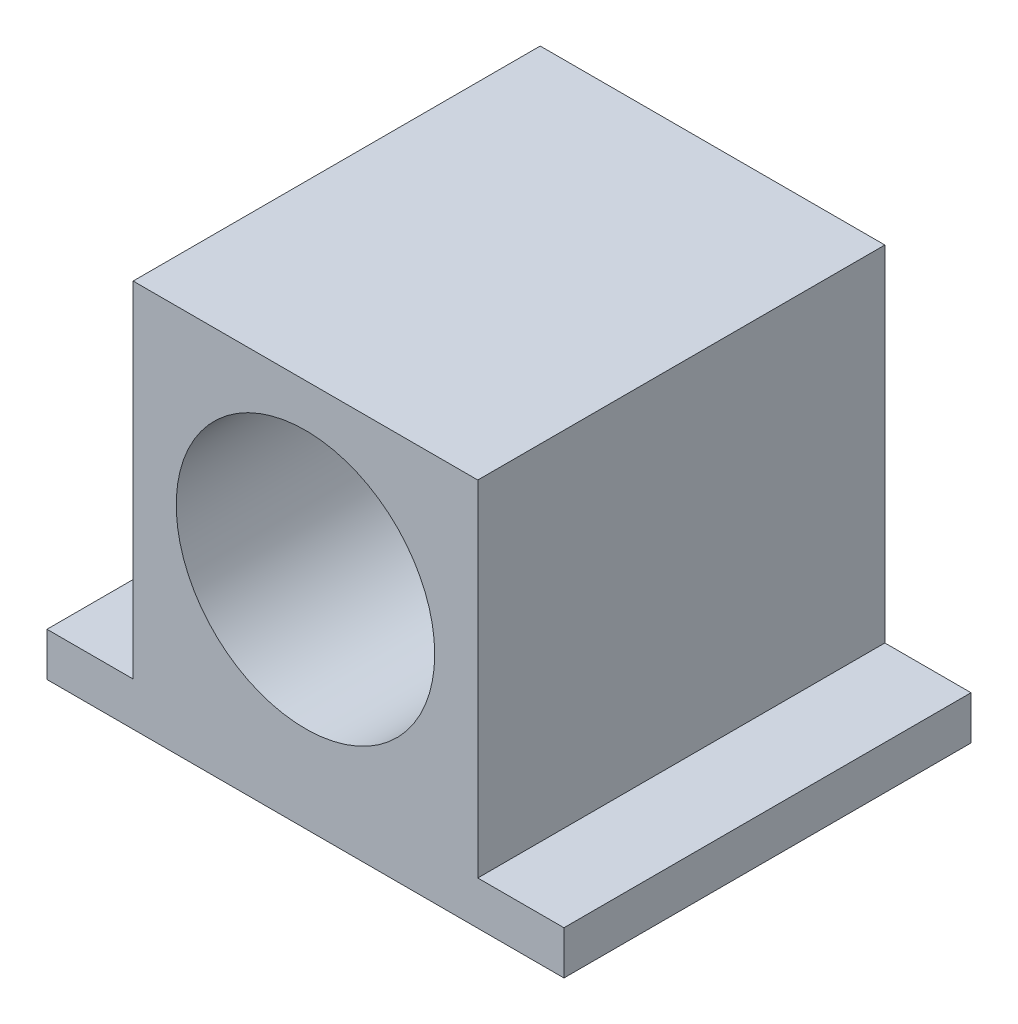
ISO-10303-21;
HEADER;
FILE_DESCRIPTION(('STEP AP214'),'2;1');
FILE_NAME('part.step','',(''),(''),'','','');
FILE_SCHEMA(('AUTOMOTIVE_DESIGN { 1 0 10303 214 1 1 1 1 }'));
ENDSEC;
DATA;
#1=APPLICATION_CONTEXT('core data for automotive mechanical design processes');
#2=APPLICATION_PROTOCOL_DEFINITION('international standard','automotive_design',2000,#1);
#3=PRODUCT_CONTEXT('',#1,'mechanical');
#4=PRODUCT('Part','Part','',(#3));
#5=PRODUCT_RELATED_PRODUCT_CATEGORY('part','',(#4));
#6=PRODUCT_DEFINITION_FORMATION('','',#4);
#7=PRODUCT_DEFINITION_CONTEXT('part definition',#1,'design');
#8=PRODUCT_DEFINITION('design','',#6,#7);
#9=PRODUCT_DEFINITION_SHAPE('','',#8);
#10=(LENGTH_UNIT() NAMED_UNIT(*) SI_UNIT(.MILLI.,.METRE.));
#11=(NAMED_UNIT(*) PLANE_ANGLE_UNIT() SI_UNIT($,.RADIAN.));
#12=(NAMED_UNIT(*) SI_UNIT($,.STERADIAN.) SOLID_ANGLE_UNIT());
#13=UNCERTAINTY_MEASURE_WITH_UNIT(LENGTH_MEASURE(1.E-05),#10,'distance_accuracy_value','');
#14=(GEOMETRIC_REPRESENTATION_CONTEXT(3) GLOBAL_UNCERTAINTY_ASSIGNED_CONTEXT((#13)) GLOBAL_UNIT_ASSIGNED_CONTEXT((#10,
#11,#12)) REPRESENTATION_CONTEXT('',''));
#15=CARTESIAN_POINT('',(0.,0.,0.));
#16=DIRECTION('',(0.,0.,1.));
#17=DIRECTION('',(1.,0.,0.));
#18=AXIS2_PLACEMENT_3D('',#15,#16,#17);
#19=CARTESIAN_POINT('',(19.05,0.,30.));
#20=DIRECTION('',(1.,0.,0.));
#21=DIRECTION('',(0.,1.,0.));
#22=AXIS2_PLACEMENT_3D('',#19,#20,#21);
#23=PLANE('',#22);
#24=DIRECTION('',(0.,-1.,0.));
#25=VECTOR('',#24,1.);
#26=CARTESIAN_POINT('',(19.05,0.,0.));
#27=LINE('',#26,#25);
#28=CARTESIAN_POINT('',(19.05,-12.7,0.));
#29=VERTEX_POINT('',#28);
#30=CARTESIAN_POINT('',(19.05,-15.9079946,0.));
#31=VERTEX_POINT('',#30);
#32=EDGE_CURVE('E131',#29,#31,#27,.T.);
#33=ORIENTED_EDGE('',*,*,#32,.F.);
#34=DIRECTION('',(0.,0.,-1.));
#35=VECTOR('',#34,1.);
#36=CARTESIAN_POINT('',(19.05,-12.7,30.));
#37=LINE('',#36,#35);
#38=CARTESIAN_POINT('',(19.05,-12.7,30.));
#39=VERTEX_POINT('',#38);
#40=EDGE_CURVE('E11',#39,#29,#37,.T.);
#41=ORIENTED_EDGE('',*,*,#40,.F.);
#42=DIRECTION('',(0.,-1.,0.));
#43=VECTOR('',#42,1.);
#44=CARTESIAN_POINT('',(19.05,0.,30.));
#45=LINE('',#44,#43);
#46=CARTESIAN_POINT('',(19.05,-15.9079946,30.));
#47=VERTEX_POINT('',#46);
#48=EDGE_CURVE('E175',#39,#47,#45,.T.);
#49=ORIENTED_EDGE('',*,*,#48,.T.);
#50=DIRECTION('',(0.,0.,-1.));
#51=VECTOR('',#50,1.);
#52=CARTESIAN_POINT('',(19.05,-15.9079946,30.));
#53=LINE('',#52,#51);
#54=EDGE_CURVE('E86',#47,#31,#53,.T.);
#55=ORIENTED_EDGE('',*,*,#54,.T.);
#56=EDGE_LOOP('',(#33,#41,#49,#55));
#57=FACE_BOUND('',#56,.T.);
#58=ADVANCED_FACE('F35',(#57),#23,.T.);
#59=CARTESIAN_POINT('',(0.,-12.7,30.));
#60=DIRECTION('',(0.,1.,0.));
#61=DIRECTION('',(-1.,0.,0.));
#62=AXIS2_PLACEMENT_3D('',#59,#60,#61);
#63=PLANE('',#62);
#64=DIRECTION('',(1.,0.,0.));
#65=VECTOR('',#64,1.);
#66=CARTESIAN_POINT('',(0.,-12.7,0.));
#67=LINE('',#66,#65);
#68=CARTESIAN_POINT('',(12.7,-12.7,0.));
#69=VERTEX_POINT('',#68);
#70=EDGE_CURVE('E134',#69,#29,#67,.T.);
#71=ORIENTED_EDGE('',*,*,#70,.F.);
#72=DIRECTION('',(0.,0.,-1.));
#73=VECTOR('',#72,1.);
#74=CARTESIAN_POINT('',(12.7,-12.7,30.));
#75=LINE('',#74,#73);
#76=CARTESIAN_POINT('',(12.7,-12.7,30.));
#77=VERTEX_POINT('',#76);
#78=EDGE_CURVE('E44',#77,#69,#75,.T.);
#79=ORIENTED_EDGE('',*,*,#78,.F.);
#80=DIRECTION('',(1.,0.,0.));
#81=VECTOR('',#80,1.);
#82=CARTESIAN_POINT('',(0.,-12.7,30.));
#83=LINE('',#82,#81);
#84=EDGE_CURVE('E173',#77,#39,#83,.T.);
#85=ORIENTED_EDGE('',*,*,#84,.T.);
#86=ORIENTED_EDGE('',*,*,#40,.T.);
#87=EDGE_LOOP('',(#71,#79,#85,#86));
#88=FACE_BOUND('',#87,.T.);
#89=ADVANCED_FACE('F172',(#88),#63,.T.);
#90=CARTESIAN_POINT('',(12.7,0.,30.));
#91=DIRECTION('',(-1.,0.,0.));
#92=DIRECTION('',(0.,0.,1.));
#93=AXIS2_PLACEMENT_3D('',#90,#91,#92);
#94=PLANE('',#93);
#95=DIRECTION('',(0.,1.,0.));
#96=VECTOR('',#95,1.);
#97=CARTESIAN_POINT('',(12.7,0.,0.));
#98=LINE('',#97,#96);
#99=CARTESIAN_POINT('',(12.7,12.7,0.));
#100=VERTEX_POINT('',#99);
#101=EDGE_CURVE('E137',#69,#100,#98,.T.);
#102=ORIENTED_EDGE('',*,*,#101,.T.);
#103=DIRECTION('',(0.,0.,-1.));
#104=VECTOR('',#103,1.);
#105=CARTESIAN_POINT('',(12.7,12.7,30.));
#106=LINE('',#105,#104);
#107=CARTESIAN_POINT('',(12.7,12.7,30.));
#108=VERTEX_POINT('',#107);
#109=EDGE_CURVE('E157',#108,#100,#106,.T.);
#110=ORIENTED_EDGE('',*,*,#109,.F.);
#111=DIRECTION('',(0.,1.,0.));
#112=VECTOR('',#111,1.);
#113=CARTESIAN_POINT('',(12.7,0.,30.));
#114=LINE('',#113,#112);
#115=EDGE_CURVE('E165',#77,#108,#114,.T.);
#116=ORIENTED_EDGE('',*,*,#115,.F.);
#117=ORIENTED_EDGE('',*,*,#78,.T.);
#118=EDGE_LOOP('',(#102,#110,#116,#117));
#119=FACE_BOUND('',#118,.T.);
#120=ADVANCED_FACE('F162',(#119),#94,.F.);
#121=CARTESIAN_POINT('',(0.,12.7,30.));
#122=DIRECTION('',(0.,-1.,0.));
#123=DIRECTION('',(0.,0.,-1.));
#124=AXIS2_PLACEMENT_3D('',#121,#122,#123);
#125=PLANE('',#124);
#126=DIRECTION('',(-1.,0.,0.));
#127=VECTOR('',#126,1.);
#128=CARTESIAN_POINT('',(0.,12.7,0.));
#129=LINE('',#128,#127);
#130=CARTESIAN_POINT('',(-12.7,12.7,0.));
#131=VERTEX_POINT('',#130);
#132=EDGE_CURVE('E140',#100,#131,#129,.T.);
#133=ORIENTED_EDGE('',*,*,#132,.T.);
#134=DIRECTION('',(0.,0.,-1.));
#135=VECTOR('',#134,1.);
#136=CARTESIAN_POINT('',(-12.7,12.7,30.));
#137=LINE('',#136,#135);
#138=CARTESIAN_POINT('',(-12.7,12.7,30.));
#139=VERTEX_POINT('',#138);
#140=EDGE_CURVE('E155',#139,#131,#137,.T.);
#141=ORIENTED_EDGE('',*,*,#140,.F.);
#142=DIRECTION('',(-1.,0.,0.));
#143=VECTOR('',#142,1.);
#144=CARTESIAN_POINT('',(0.,12.7,30.));
#145=LINE('',#144,#143);
#146=EDGE_CURVE('E182',#108,#139,#145,.T.);
#147=ORIENTED_EDGE('',*,*,#146,.F.);
#148=ORIENTED_EDGE('',*,*,#109,.T.);
#149=EDGE_LOOP('',(#133,#141,#147,#148));
#150=FACE_BOUND('',#149,.T.);
#151=ADVANCED_FACE('F188',(#150),#125,.F.);
#152=CARTESIAN_POINT('',(-12.7,0.,30.));
#153=DIRECTION('',(-1.,0.,0.));
#154=DIRECTION('',(0.,0.,1.));
#155=AXIS2_PLACEMENT_3D('',#152,#153,#154);
#156=PLANE('',#155);
#157=DIRECTION('',(0.,1.,0.));
#158=VECTOR('',#157,1.);
#159=CARTESIAN_POINT('',(-12.7,0.,0.));
#160=LINE('',#159,#158);
#161=CARTESIAN_POINT('',(-12.7,-12.7,0.));
#162=VERTEX_POINT('',#161);
#163=EDGE_CURVE('E143',#162,#131,#160,.T.);
#164=ORIENTED_EDGE('',*,*,#163,.F.);
#165=DIRECTION('',(0.,0.,-1.));
#166=VECTOR('',#165,1.);
#167=CARTESIAN_POINT('',(-12.7,-12.7,30.));
#168=LINE('',#167,#166);
#169=CARTESIAN_POINT('',(-12.7,-12.7,30.));
#170=VERTEX_POINT('',#169);
#171=EDGE_CURVE('E115',#170,#162,#168,.T.);
#172=ORIENTED_EDGE('',*,*,#171,.F.);
#173=DIRECTION('',(0.,1.,0.));
#174=VECTOR('',#173,1.);
#175=CARTESIAN_POINT('',(-12.7,0.,30.));
#176=LINE('',#175,#174);
#177=EDGE_CURVE('E121',#170,#139,#176,.T.);
#178=ORIENTED_EDGE('',*,*,#177,.T.);
#179=ORIENTED_EDGE('',*,*,#140,.T.);
#180=EDGE_LOOP('',(#164,#172,#178,#179));
#181=FACE_BOUND('',#180,.T.);
#182=ADVANCED_FACE('F185',(#181),#156,.T.);
#183=CARTESIAN_POINT('',(0.,-12.7,30.));
#184=DIRECTION('',(0.,1.,0.));
#185=DIRECTION('',(0.,0.,1.));
#186=AXIS2_PLACEMENT_3D('',#183,#184,#185);
#187=PLANE('',#186);
#188=DIRECTION('',(1.,0.,0.));
#189=VECTOR('',#188,1.);
#190=CARTESIAN_POINT('',(0.,-12.7,0.));
#191=LINE('',#190,#189);
#192=CARTESIAN_POINT('',(-19.05,-12.7,0.));
#193=VERTEX_POINT('',#192);
#194=EDGE_CURVE('E110',#193,#162,#191,.T.);
#195=ORIENTED_EDGE('',*,*,#194,.F.);
#196=DIRECTION('',(0.,0.,-1.));
#197=VECTOR('',#196,1.);
#198=CARTESIAN_POINT('',(-19.05,-12.7,30.));
#199=LINE('',#198,#197);
#200=CARTESIAN_POINT('',(-19.05,-12.7,30.));
#201=VERTEX_POINT('',#200);
#202=EDGE_CURVE('E105',#201,#193,#199,.T.);
#203=ORIENTED_EDGE('',*,*,#202,.F.);
#204=DIRECTION('',(1.,0.,0.));
#205=VECTOR('',#204,1.);
#206=CARTESIAN_POINT('',(0.,-12.7,30.));
#207=LINE('',#206,#205);
#208=EDGE_CURVE('E108',#201,#170,#207,.T.);
#209=ORIENTED_EDGE('',*,*,#208,.T.);
#210=ORIENTED_EDGE('',*,*,#171,.T.);
#211=EDGE_LOOP('',(#195,#203,#209,#210));
#212=FACE_BOUND('',#211,.T.);
#213=ADVANCED_FACE('F107',(#212),#187,.T.);
#214=CARTESIAN_POINT('',(-19.05,0.,30.));
#215=DIRECTION('',(-1.,0.,0.));
#216=DIRECTION('',(0.,0.,1.));
#217=AXIS2_PLACEMENT_3D('',#214,#215,#216);
#218=PLANE('',#217);
#219=DIRECTION('',(0.,1.,0.));
#220=VECTOR('',#219,1.);
#221=CARTESIAN_POINT('',(-19.05,0.,0.));
#222=LINE('',#221,#220);
#223=CARTESIAN_POINT('',(-19.05,-15.9079946,0.));
#224=VERTEX_POINT('',#223);
#225=EDGE_CURVE('E147',#224,#193,#222,.T.);
#226=ORIENTED_EDGE('',*,*,#225,.F.);
#227=DIRECTION('',(0.,0.,-1.));
#228=VECTOR('',#227,1.);
#229=CARTESIAN_POINT('',(-19.05,-15.9079946,30.));
#230=LINE('',#229,#228);
#231=CARTESIAN_POINT('',(-19.05,-15.9079946,30.));
#232=VERTEX_POINT('',#231);
#233=EDGE_CURVE('E79',#232,#224,#230,.T.);
#234=ORIENTED_EDGE('',*,*,#233,.F.);
#235=DIRECTION('',(0.,1.,0.));
#236=VECTOR('',#235,1.);
#237=CARTESIAN_POINT('',(-19.05,0.,30.));
#238=LINE('',#237,#236);
#239=EDGE_CURVE('E119',#232,#201,#238,.T.);
#240=ORIENTED_EDGE('',*,*,#239,.T.);
#241=ORIENTED_EDGE('',*,*,#202,.T.);
#242=EDGE_LOOP('',(#226,#234,#240,#241));
#243=FACE_BOUND('',#242,.T.);
#244=ADVANCED_FACE('F123',(#243),#218,.T.);
#245=CARTESIAN_POINT('',(0.,0.,30.));
#246=DIRECTION('',(0.,0.,-1.));
#247=DIRECTION('',(-1.,0.,0.));
#248=AXIS2_PLACEMENT_3D('',#245,#246,#247);
#249=CYLINDRICAL_SURFACE('',#248,9.525);
#250=CARTESIAN_POINT('',(0.,0.,30.));
#251=DIRECTION('',(0.,0.,1.));
#252=DIRECTION('',(1.,0.,0.));
#253=AXIS2_PLACEMENT_3D('',#250,#251,#252);
#254=CIRCLE('',#253,9.525);
#255=CARTESIAN_POINT('',(9.525,0.,30.));
#256=VERTEX_POINT('',#255);
#257=EDGE_CURVE('E151',#256,#256,#254,.T.);
#258=ORIENTED_EDGE('',*,*,#257,.T.);
#259=EDGE_LOOP('',(#258));
#260=FACE_BOUND('',#259,.T.);
#261=CARTESIAN_POINT('',(0.,0.,0.));
#262=DIRECTION('',(0.,0.,1.));
#263=DIRECTION('',(1.,0.,0.));
#264=AXIS2_PLACEMENT_3D('',#261,#262,#263);
#265=CIRCLE('',#264,9.525);
#266=CARTESIAN_POINT('',(9.525,0.,0.));
#267=VERTEX_POINT('',#266);
#268=EDGE_CURVE('E128',#267,#267,#265,.T.);
#269=ORIENTED_EDGE('',*,*,#268,.F.);
#270=EDGE_LOOP('',(#269));
#271=FACE_BOUND('',#270,.T.);
#272=ADVANCED_FACE('F37',(#260,#271),#249,.F.);
#273=CARTESIAN_POINT('',(0.,-15.9079946,30.));
#274=DIRECTION('',(0.,1.,0.));
#275=DIRECTION('',(0.,0.,1.));
#276=AXIS2_PLACEMENT_3D('',#273,#274,#275);
#277=PLANE('',#276);
#278=DIRECTION('',(1.,0.,0.));
#279=VECTOR('',#278,1.);
#280=CARTESIAN_POINT('',(0.,-15.9079946,0.));
#281=LINE('',#280,#279);
#282=EDGE_CURVE('E149',#224,#31,#281,.T.);
#283=ORIENTED_EDGE('',*,*,#282,.T.);
#284=ORIENTED_EDGE('',*,*,#54,.F.);
#285=DIRECTION('',(1.,0.,0.));
#286=VECTOR('',#285,1.);
#287=CARTESIAN_POINT('',(0.,-15.9079946,30.));
#288=LINE('',#287,#286);
#289=EDGE_CURVE('E52',#232,#47,#288,.T.);
#290=ORIENTED_EDGE('',*,*,#289,.F.);
#291=ORIENTED_EDGE('',*,*,#233,.T.);
#292=EDGE_LOOP('',(#283,#284,#290,#291));
#293=FACE_BOUND('',#292,.T.);
#294=ADVANCED_FACE('F174',(#293),#277,.F.);
#295=CARTESIAN_POINT('',(0.,0.,30.));
#296=DIRECTION('',(0.,0.,1.));
#297=DIRECTION('',(1.,0.,0.));
#298=AXIS2_PLACEMENT_3D('',#295,#296,#297);
#299=PLANE('',#298);
#300=ORIENTED_EDGE('',*,*,#257,.F.);
#301=EDGE_LOOP('',(#300));
#302=FACE_BOUND('',#301,.T.);
#303=ORIENTED_EDGE('',*,*,#48,.F.);
#304=ORIENTED_EDGE('',*,*,#84,.F.);
#305=ORIENTED_EDGE('',*,*,#115,.T.);
#306=ORIENTED_EDGE('',*,*,#146,.T.);
#307=ORIENTED_EDGE('',*,*,#177,.F.);
#308=ORIENTED_EDGE('',*,*,#208,.F.);
#309=ORIENTED_EDGE('',*,*,#239,.F.);
#310=ORIENTED_EDGE('',*,*,#289,.T.);
#311=EDGE_LOOP('',(#303,#304,#305,#306,#307,#308,#309,#310));
#312=FACE_BOUND('',#311,.T.);
#313=ADVANCED_FACE('F118',(#302,#312),#299,.T.);
#314=CARTESIAN_POINT('',(0.,0.,0.));
#315=DIRECTION('',(0.,0.,1.));
#316=DIRECTION('',(1.,0.,0.));
#317=AXIS2_PLACEMENT_3D('',#314,#315,#316);
#318=PLANE('',#317);
#319=ORIENTED_EDGE('',*,*,#268,.T.);
#320=EDGE_LOOP('',(#319));
#321=FACE_BOUND('',#320,.T.);
#322=ORIENTED_EDGE('',*,*,#32,.T.);
#323=ORIENTED_EDGE('',*,*,#282,.F.);
#324=ORIENTED_EDGE('',*,*,#225,.T.);
#325=ORIENTED_EDGE('',*,*,#194,.T.);
#326=ORIENTED_EDGE('',*,*,#163,.T.);
#327=ORIENTED_EDGE('',*,*,#132,.F.);
#328=ORIENTED_EDGE('',*,*,#101,.F.);
#329=ORIENTED_EDGE('',*,*,#70,.T.);
#330=EDGE_LOOP('',(#322,#323,#324,#325,#326,#327,#328,#329));
#331=FACE_BOUND('',#330,.T.);
#332=ADVANCED_FACE('F171',(#321,#331),#318,.F.);
#333=CLOSED_SHELL('',(#58,#89,#120,#151,#182,#213,#244,#272,#294,#313,#332));
#334=MANIFOLD_SOLID_BREP('B2',#333);
#335=ADVANCED_BREP_SHAPE_REPRESENTATION('',(#18,#334),#14);
#336=SHAPE_DEFINITION_REPRESENTATION(#9,#335);
ENDSEC;
END-ISO-10303-21;
